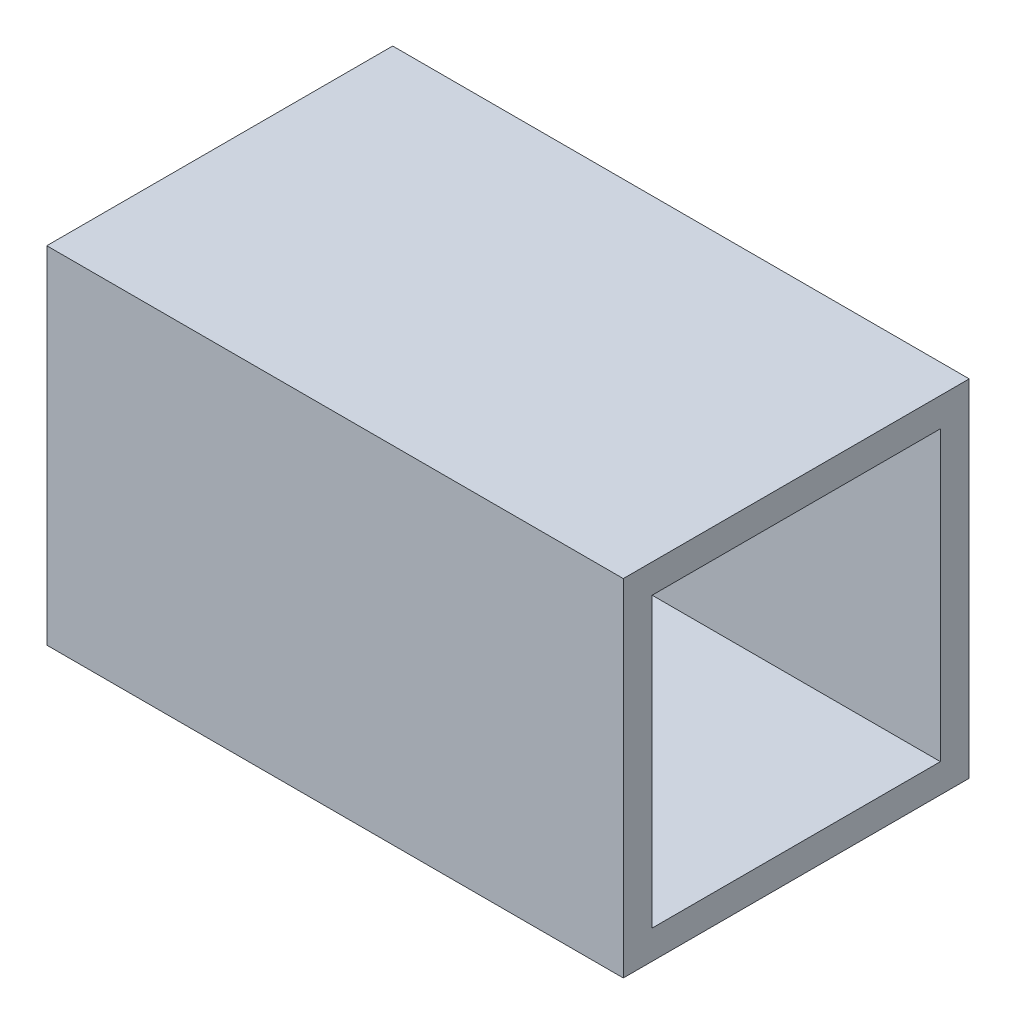
ISO-10303-21;
HEADER;
FILE_DESCRIPTION(('STEP AP214'),'2;1');
FILE_NAME('part.step','',(''),(''),'','','');
FILE_SCHEMA(('AUTOMOTIVE_DESIGN { 1 0 10303 214 1 1 1 1 }'));
ENDSEC;
DATA;
#1=APPLICATION_CONTEXT('core data for automotive mechanical design processes');
#2=APPLICATION_PROTOCOL_DEFINITION('international standard','automotive_design',2000,#1);
#3=PRODUCT_CONTEXT('',#1,'mechanical');
#4=PRODUCT('Part','Part','',(#3));
#5=PRODUCT_RELATED_PRODUCT_CATEGORY('part','',(#4));
#6=PRODUCT_DEFINITION_FORMATION('','',#4);
#7=PRODUCT_DEFINITION_CONTEXT('part definition',#1,'design');
#8=PRODUCT_DEFINITION('design','',#6,#7);
#9=PRODUCT_DEFINITION_SHAPE('','',#8);
#10=(LENGTH_UNIT() NAMED_UNIT(*) SI_UNIT(.MILLI.,.METRE.));
#11=(NAMED_UNIT(*) PLANE_ANGLE_UNIT() SI_UNIT($,.RADIAN.));
#12=(NAMED_UNIT(*) SI_UNIT($,.STERADIAN.) SOLID_ANGLE_UNIT());
#13=UNCERTAINTY_MEASURE_WITH_UNIT(LENGTH_MEASURE(1.E-05),#10,'distance_accuracy_value','');
#14=(GEOMETRIC_REPRESENTATION_CONTEXT(3) GLOBAL_UNCERTAINTY_ASSIGNED_CONTEXT((#13)) GLOBAL_UNIT_ASSIGNED_CONTEXT((#10,
#11,#12)) REPRESENTATION_CONTEXT('',''));
#15=CARTESIAN_POINT('',(0.,0.,0.));
#16=DIRECTION('',(0.,0.,1.));
#17=DIRECTION('',(1.,0.,0.));
#18=AXIS2_PLACEMENT_3D('',#15,#16,#17);
#19=CARTESIAN_POINT('',(40.,0.,0.));
#20=DIRECTION('',(1.,0.,0.));
#21=DIRECTION('',(0.,0.,-1.));
#22=AXIS2_PLACEMENT_3D('',#19,#20,#21);
#23=PLANE('',#22);
#24=DIRECTION('',(0.,-1.,0.));
#25=VECTOR('',#24,1.);
#26=CARTESIAN_POINT('',(40.,12.,12.));
#27=LINE('',#26,#25);
#28=CARTESIAN_POINT('',(40.,12.,12.));
#29=VERTEX_POINT('',#28);
#30=CARTESIAN_POINT('',(40.,-12.,12.));
#31=VERTEX_POINT('',#30);
#32=EDGE_CURVE('E142',#29,#31,#27,.T.);
#33=ORIENTED_EDGE('',*,*,#32,.T.);
#34=DIRECTION('',(0.,0.,-1.));
#35=VECTOR('',#34,1.);
#36=CARTESIAN_POINT('',(40.,-12.,12.));
#37=LINE('',#36,#35);
#38=CARTESIAN_POINT('',(40.,-12.,-12.));
#39=VERTEX_POINT('',#38);
#40=EDGE_CURVE('E145',#31,#39,#37,.T.);
#41=ORIENTED_EDGE('',*,*,#40,.T.);
#42=DIRECTION('',(0.,1.,0.));
#43=VECTOR('',#42,1.);
#44=CARTESIAN_POINT('',(40.,12.,-12.));
#45=LINE('',#44,#43);
#46=CARTESIAN_POINT('',(40.,12.,-12.));
#47=VERTEX_POINT('',#46);
#48=EDGE_CURVE('E148',#39,#47,#45,.T.);
#49=ORIENTED_EDGE('',*,*,#48,.T.);
#50=DIRECTION('',(0.,0.,1.));
#51=VECTOR('',#50,1.);
#52=CARTESIAN_POINT('',(40.,12.,12.));
#53=LINE('',#52,#51);
#54=EDGE_CURVE('E150',#47,#29,#53,.T.);
#55=ORIENTED_EDGE('',*,*,#54,.T.);
#56=EDGE_LOOP('',(#33,#41,#49,#55));
#57=FACE_BOUND('',#56,.T.);
#58=DIRECTION('',(0.,0.,1.));
#59=VECTOR('',#58,1.);
#60=CARTESIAN_POINT('',(40.,10.,10.));
#61=LINE('',#60,#59);
#62=CARTESIAN_POINT('',(40.,10.,-10.));
#63=VERTEX_POINT('',#62);
#64=CARTESIAN_POINT('',(40.,10.,10.));
#65=VERTEX_POINT('',#64);
#66=EDGE_CURVE('E113',#63,#65,#61,.T.);
#67=ORIENTED_EDGE('',*,*,#66,.F.);
#68=DIRECTION('',(0.,1.,0.));
#69=VECTOR('',#68,1.);
#70=CARTESIAN_POINT('',(40.,10.,-10.));
#71=LINE('',#70,#69);
#72=CARTESIAN_POINT('',(40.,-10.,-10.));
#73=VERTEX_POINT('',#72);
#74=EDGE_CURVE('E105',#73,#63,#71,.T.);
#75=ORIENTED_EDGE('',*,*,#74,.F.);
#76=DIRECTION('',(0.,0.,-1.));
#77=VECTOR('',#76,1.);
#78=CARTESIAN_POINT('',(40.,-10.,10.));
#79=LINE('',#78,#77);
#80=CARTESIAN_POINT('',(40.,-10.,10.));
#81=VERTEX_POINT('',#80);
#82=EDGE_CURVE('E127',#81,#73,#79,.T.);
#83=ORIENTED_EDGE('',*,*,#82,.F.);
#84=DIRECTION('',(0.,-1.,0.));
#85=VECTOR('',#84,1.);
#86=CARTESIAN_POINT('',(40.,10.,10.));
#87=LINE('',#86,#85);
#88=EDGE_CURVE('E125',#65,#81,#87,.T.);
#89=ORIENTED_EDGE('',*,*,#88,.F.);
#90=EDGE_LOOP('',(#67,#75,#83,#89));
#91=FACE_BOUND('',#90,.T.);
#92=ADVANCED_FACE('F39',(#57,#91),#23,.T.);
#93=CARTESIAN_POINT('',(0.,0.,0.));
#94=DIRECTION('',(1.,0.,0.));
#95=DIRECTION('',(0.,0.,-1.));
#96=AXIS2_PLACEMENT_3D('',#93,#94,#95);
#97=PLANE('',#96);
#98=DIRECTION('',(0.,-1.,0.));
#99=VECTOR('',#98,1.);
#100=CARTESIAN_POINT('',(0.,12.,12.));
#101=LINE('',#100,#99);
#102=CARTESIAN_POINT('',(0.,12.,12.));
#103=VERTEX_POINT('',#102);
#104=CARTESIAN_POINT('',(0.,-12.,12.));
#105=VERTEX_POINT('',#104);
#106=EDGE_CURVE('E121',#103,#105,#101,.T.);
#107=ORIENTED_EDGE('',*,*,#106,.F.);
#108=DIRECTION('',(0.,0.,1.));
#109=VECTOR('',#108,1.);
#110=CARTESIAN_POINT('',(0.,12.,12.));
#111=LINE('',#110,#109);
#112=CARTESIAN_POINT('',(0.,12.,-12.));
#113=VERTEX_POINT('',#112);
#114=EDGE_CURVE('E146',#113,#103,#111,.T.);
#115=ORIENTED_EDGE('',*,*,#114,.F.);
#116=DIRECTION('',(0.,1.,0.));
#117=VECTOR('',#116,1.);
#118=CARTESIAN_POINT('',(0.,12.,-12.));
#119=LINE('',#118,#117);
#120=CARTESIAN_POINT('',(0.,-12.,-12.));
#121=VERTEX_POINT('',#120);
#122=EDGE_CURVE('E157',#121,#113,#119,.T.);
#123=ORIENTED_EDGE('',*,*,#122,.F.);
#124=DIRECTION('',(0.,0.,-1.));
#125=VECTOR('',#124,1.);
#126=CARTESIAN_POINT('',(0.,-12.,12.));
#127=LINE('',#126,#125);
#128=EDGE_CURVE('E155',#105,#121,#127,.T.);
#129=ORIENTED_EDGE('',*,*,#128,.F.);
#130=EDGE_LOOP('',(#107,#115,#123,#129));
#131=FACE_BOUND('',#130,.T.);
#132=DIRECTION('',(0.,1.,0.));
#133=VECTOR('',#132,1.);
#134=CARTESIAN_POINT('',(0.,10.,-10.));
#135=LINE('',#134,#133);
#136=CARTESIAN_POINT('',(0.,-10.,-10.));
#137=VERTEX_POINT('',#136);
#138=CARTESIAN_POINT('',(0.,10.,-10.));
#139=VERTEX_POINT('',#138);
#140=EDGE_CURVE('E63',#137,#139,#135,.T.);
#141=ORIENTED_EDGE('',*,*,#140,.T.);
#142=DIRECTION('',(0.,0.,1.));
#143=VECTOR('',#142,1.);
#144=CARTESIAN_POINT('',(0.,10.,10.));
#145=LINE('',#144,#143);
#146=CARTESIAN_POINT('',(0.,10.,10.));
#147=VERTEX_POINT('',#146);
#148=EDGE_CURVE('E120',#139,#147,#145,.T.);
#149=ORIENTED_EDGE('',*,*,#148,.T.);
#150=DIRECTION('',(0.,-1.,0.));
#151=VECTOR('',#150,1.);
#152=CARTESIAN_POINT('',(0.,10.,10.));
#153=LINE('',#152,#151);
#154=CARTESIAN_POINT('',(0.,-10.,10.));
#155=VERTEX_POINT('',#154);
#156=EDGE_CURVE('E134',#147,#155,#153,.T.);
#157=ORIENTED_EDGE('',*,*,#156,.T.);
#158=DIRECTION('',(0.,0.,-1.));
#159=VECTOR('',#158,1.);
#160=CARTESIAN_POINT('',(0.,-10.,10.));
#161=LINE('',#160,#159);
#162=EDGE_CURVE('E114',#155,#137,#161,.T.);
#163=ORIENTED_EDGE('',*,*,#162,.T.);
#164=EDGE_LOOP('',(#141,#149,#157,#163));
#165=FACE_BOUND('',#164,.T.);
#166=ADVANCED_FACE('F180',(#131,#165),#97,.F.);
#167=CARTESIAN_POINT('',(40.,12.,12.));
#168=DIRECTION('',(0.,0.,-1.));
#169=DIRECTION('',(0.,1.,0.));
#170=AXIS2_PLACEMENT_3D('',#167,#168,#169);
#171=PLANE('',#170);
#172=ORIENTED_EDGE('',*,*,#106,.T.);
#173=DIRECTION('',(-1.,0.,0.));
#174=VECTOR('',#173,1.);
#175=CARTESIAN_POINT('',(40.,-12.,12.));
#176=LINE('',#175,#174);
#177=EDGE_CURVE('E43',#31,#105,#176,.T.);
#178=ORIENTED_EDGE('',*,*,#177,.F.);
#179=ORIENTED_EDGE('',*,*,#32,.F.);
#180=DIRECTION('',(-1.,0.,0.));
#181=VECTOR('',#180,1.);
#182=CARTESIAN_POINT('',(40.,12.,12.));
#183=LINE('',#182,#181);
#184=EDGE_CURVE('E152',#29,#103,#183,.T.);
#185=ORIENTED_EDGE('',*,*,#184,.T.);
#186=EDGE_LOOP('',(#172,#178,#179,#185));
#187=FACE_BOUND('',#186,.T.);
#188=ADVANCED_FACE('F41',(#187),#171,.F.);
#189=CARTESIAN_POINT('',(40.,-12.,12.));
#190=DIRECTION('',(0.,1.,0.));
#191=DIRECTION('',(0.,0.,1.));
#192=AXIS2_PLACEMENT_3D('',#189,#190,#191);
#193=PLANE('',#192);
#194=ORIENTED_EDGE('',*,*,#128,.T.);
#195=DIRECTION('',(-1.,0.,0.));
#196=VECTOR('',#195,1.);
#197=CARTESIAN_POINT('',(40.,-12.,-12.));
#198=LINE('',#197,#196);
#199=EDGE_CURVE('E164',#39,#121,#198,.T.);
#200=ORIENTED_EDGE('',*,*,#199,.F.);
#201=ORIENTED_EDGE('',*,*,#40,.F.);
#202=ORIENTED_EDGE('',*,*,#177,.T.);
#203=EDGE_LOOP('',(#194,#200,#201,#202));
#204=FACE_BOUND('',#203,.T.);
#205=ADVANCED_FACE('F173',(#204),#193,.F.);
#206=CARTESIAN_POINT('',(40.,12.,-12.));
#207=DIRECTION('',(0.,0.,1.));
#208=DIRECTION('',(0.,-1.,0.));
#209=AXIS2_PLACEMENT_3D('',#206,#207,#208);
#210=PLANE('',#209);
#211=CARTESIAN_POINT('',(20.,0.,-12.));
#212=DIRECTION('',(0.,0.,-1.));
#213=DIRECTION('',(0.,1.,0.));
#214=AXIS2_PLACEMENT_3D('',#211,#212,#213);
#215=CIRCLE('',#214,5.);
#216=CARTESIAN_POINT('',(20.,5.,-12.));
#217=VERTEX_POINT('',#216);
#218=EDGE_CURVE('E11',#217,#217,#215,.T.);
#219=ORIENTED_EDGE('',*,*,#218,.F.);
#220=EDGE_LOOP('',(#219));
#221=FACE_BOUND('',#220,.T.);
#222=ORIENTED_EDGE('',*,*,#122,.T.);
#223=DIRECTION('',(-1.,0.,0.));
#224=VECTOR('',#223,1.);
#225=CARTESIAN_POINT('',(40.,12.,-12.));
#226=LINE('',#225,#224);
#227=EDGE_CURVE('E162',#47,#113,#226,.T.);
#228=ORIENTED_EDGE('',*,*,#227,.F.);
#229=ORIENTED_EDGE('',*,*,#48,.F.);
#230=ORIENTED_EDGE('',*,*,#199,.T.);
#231=EDGE_LOOP('',(#222,#228,#229,#230));
#232=FACE_BOUND('',#231,.T.);
#233=ADVANCED_FACE('F183',(#221,#232),#210,.F.);
#234=CARTESIAN_POINT('',(40.,12.,12.));
#235=DIRECTION('',(0.,-1.,0.));
#236=DIRECTION('',(0.,0.,-1.));
#237=AXIS2_PLACEMENT_3D('',#234,#235,#236);
#238=PLANE('',#237);
#239=ORIENTED_EDGE('',*,*,#114,.T.);
#240=ORIENTED_EDGE('',*,*,#184,.F.);
#241=ORIENTED_EDGE('',*,*,#54,.F.);
#242=ORIENTED_EDGE('',*,*,#227,.T.);
#243=EDGE_LOOP('',(#239,#240,#241,#242));
#244=FACE_BOUND('',#243,.T.);
#245=ADVANCED_FACE('F186',(#244),#238,.F.);
#246=CARTESIAN_POINT('',(40.,10.,-10.));
#247=DIRECTION('',(0.,0.,1.));
#248=DIRECTION('',(0.,-1.,0.));
#249=AXIS2_PLACEMENT_3D('',#246,#247,#248);
#250=PLANE('',#249);
#251=ORIENTED_EDGE('',*,*,#140,.F.);
#252=DIRECTION('',(-1.,0.,0.));
#253=VECTOR('',#252,1.);
#254=CARTESIAN_POINT('',(40.,-10.,-10.));
#255=LINE('',#254,#253);
#256=EDGE_CURVE('E109',#73,#137,#255,.T.);
#257=ORIENTED_EDGE('',*,*,#256,.F.);
#258=ORIENTED_EDGE('',*,*,#74,.T.);
#259=DIRECTION('',(-1.,0.,0.));
#260=VECTOR('',#259,1.);
#261=CARTESIAN_POINT('',(40.,10.,-10.));
#262=LINE('',#261,#260);
#263=EDGE_CURVE('E108',#63,#139,#262,.T.);
#264=ORIENTED_EDGE('',*,*,#263,.T.);
#265=EDGE_LOOP('',(#251,#257,#258,#264));
#266=FACE_BOUND('',#265,.T.);
#267=ADVANCED_FACE('F107',(#266),#250,.T.);
#268=CARTESIAN_POINT('',(40.,10.,10.));
#269=DIRECTION('',(0.,-1.,0.));
#270=DIRECTION('',(0.,0.,-1.));
#271=AXIS2_PLACEMENT_3D('',#268,#269,#270);
#272=PLANE('',#271);
#273=ORIENTED_EDGE('',*,*,#148,.F.);
#274=ORIENTED_EDGE('',*,*,#263,.F.);
#275=ORIENTED_EDGE('',*,*,#66,.T.);
#276=DIRECTION('',(-1.,0.,0.));
#277=VECTOR('',#276,1.);
#278=CARTESIAN_POINT('',(40.,10.,10.));
#279=LINE('',#278,#277);
#280=EDGE_CURVE('E122',#65,#147,#279,.T.);
#281=ORIENTED_EDGE('',*,*,#280,.T.);
#282=EDGE_LOOP('',(#273,#274,#275,#281));
#283=FACE_BOUND('',#282,.T.);
#284=ADVANCED_FACE('F117',(#283),#272,.T.);
#285=CARTESIAN_POINT('',(40.,10.,10.));
#286=DIRECTION('',(0.,0.,-1.));
#287=DIRECTION('',(-1.,0.,0.));
#288=AXIS2_PLACEMENT_3D('',#285,#286,#287);
#289=PLANE('',#288);
#290=ORIENTED_EDGE('',*,*,#156,.F.);
#291=ORIENTED_EDGE('',*,*,#280,.F.);
#292=ORIENTED_EDGE('',*,*,#88,.T.);
#293=DIRECTION('',(-1.,0.,0.));
#294=VECTOR('',#293,1.);
#295=CARTESIAN_POINT('',(40.,-10.,10.));
#296=LINE('',#295,#294);
#297=EDGE_CURVE('E55',#81,#155,#296,.T.);
#298=ORIENTED_EDGE('',*,*,#297,.T.);
#299=EDGE_LOOP('',(#290,#291,#292,#298));
#300=FACE_BOUND('',#299,.T.);
#301=ADVANCED_FACE('F246',(#300),#289,.T.);
#302=CARTESIAN_POINT('',(40.,-10.,10.));
#303=DIRECTION('',(0.,1.,0.));
#304=DIRECTION('',(0.,0.,1.));
#305=AXIS2_PLACEMENT_3D('',#302,#303,#304);
#306=PLANE('',#305);
#307=ORIENTED_EDGE('',*,*,#162,.F.);
#308=ORIENTED_EDGE('',*,*,#297,.F.);
#309=ORIENTED_EDGE('',*,*,#82,.T.);
#310=ORIENTED_EDGE('',*,*,#256,.T.);
#311=EDGE_LOOP('',(#307,#308,#309,#310));
#312=FACE_BOUND('',#311,.T.);
#313=ADVANCED_FACE('F253',(#312),#306,.T.);
#314=CARTESIAN_POINT('',(20.,0.,-19.));
#315=DIRECTION('',(0.,0.,1.));
#316=DIRECTION('',(0.,-1.,0.));
#317=AXIS2_PLACEMENT_3D('',#314,#315,#316);
#318=CYLINDRICAL_SURFACE('',#317,5.);
#319=CARTESIAN_POINT('',(20.,0.,-19.));
#320=DIRECTION('',(0.,0.,-1.));
#321=DIRECTION('',(0.,1.,0.));
#322=AXIS2_PLACEMENT_3D('',#319,#320,#321);
#323=CIRCLE('',#322,5.);
#324=CARTESIAN_POINT('',(20.,5.,-19.));
#325=VERTEX_POINT('',#324);
#326=EDGE_CURVE('E132',#325,#325,#323,.T.);
#327=ORIENTED_EDGE('',*,*,#326,.F.);
#328=EDGE_LOOP('',(#327));
#329=FACE_BOUND('',#328,.T.);
#330=ORIENTED_EDGE('',*,*,#218,.T.);
#331=EDGE_LOOP('',(#330));
#332=FACE_BOUND('',#331,.T.);
#333=ADVANCED_FACE('F262',(#329,#332),#318,.T.);
#334=CARTESIAN_POINT('',(20.,0.,-19.));
#335=DIRECTION('',(0.,0.,-1.));
#336=DIRECTION('',(0.,1.,0.));
#337=AXIS2_PLACEMENT_3D('',#334,#335,#336);
#338=PLANE('',#337);
#339=ORIENTED_EDGE('',*,*,#326,.T.);
#340=EDGE_LOOP('',(#339));
#341=FACE_BOUND('',#340,.T.);
#342=ADVANCED_FACE('F270',(#341),#338,.T.);
#343=CLOSED_SHELL('',(#92,#166,#188,#205,#233,#245,#267,#284,#301,#313,#333,#342));
#344=MANIFOLD_SOLID_BREP('B2',#343);
#345=ADVANCED_BREP_SHAPE_REPRESENTATION('',(#18,#344),#14);
#346=SHAPE_DEFINITION_REPRESENTATION(#9,#345);
ENDSEC;
END-ISO-10303-21;
